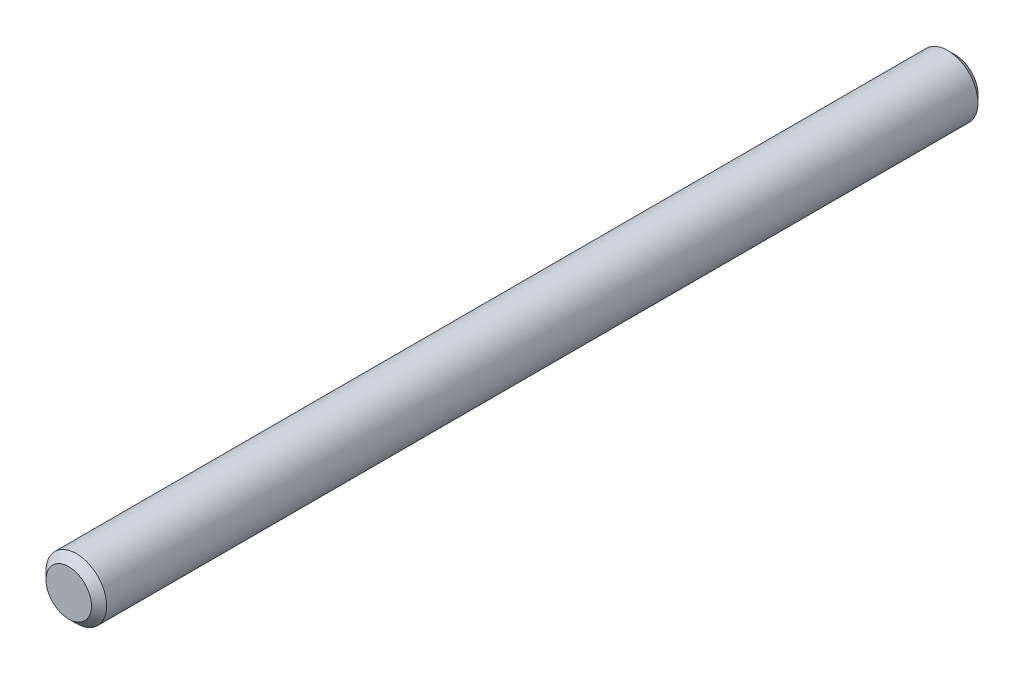
ISO-10303-21;
HEADER;
FILE_DESCRIPTION(('STEP AP214'),'2;1');
FILE_NAME('part.step','',(''),(''),'','','');
FILE_SCHEMA(('AUTOMOTIVE_DESIGN { 1 0 10303 214 1 1 1 1 }'));
ENDSEC;
DATA;
#1=APPLICATION_CONTEXT('core data for automotive mechanical design processes');
#2=APPLICATION_PROTOCOL_DEFINITION('international standard','automotive_design',2000,#1);
#3=PRODUCT_CONTEXT('',#1,'mechanical');
#4=PRODUCT('Part','Part','',(#3));
#5=PRODUCT_RELATED_PRODUCT_CATEGORY('part','',(#4));
#6=PRODUCT_DEFINITION_FORMATION('','',#4);
#7=PRODUCT_DEFINITION_CONTEXT('part definition',#1,'design');
#8=PRODUCT_DEFINITION('design','',#6,#7);
#9=PRODUCT_DEFINITION_SHAPE('','',#8);
#10=(LENGTH_UNIT() NAMED_UNIT(*) SI_UNIT(.MILLI.,.METRE.));
#11=(NAMED_UNIT(*) PLANE_ANGLE_UNIT() SI_UNIT($,.RADIAN.));
#12=(NAMED_UNIT(*) SI_UNIT($,.STERADIAN.) SOLID_ANGLE_UNIT());
#13=UNCERTAINTY_MEASURE_WITH_UNIT(LENGTH_MEASURE(1.E-05),#10,'distance_accuracy_value','');
#14=(GEOMETRIC_REPRESENTATION_CONTEXT(3) GLOBAL_UNCERTAINTY_ASSIGNED_CONTEXT((#13)) GLOBAL_UNIT_ASSIGNED_CONTEXT((#10,
#11,#12)) REPRESENTATION_CONTEXT('',''));
#15=CARTESIAN_POINT('',(0.,0.,0.));
#16=DIRECTION('',(0.,0.,1.));
#17=DIRECTION('',(1.,0.,0.));
#18=AXIS2_PLACEMENT_3D('',#15,#16,#17);
#19=CARTESIAN_POINT('',(0.,0.,11.7));
#20=DIRECTION('',(0.,0.,-1.));
#21=DIRECTION('',(-1.,0.,0.));
#22=AXIS2_PLACEMENT_3D('',#19,#20,#21);
#23=CYLINDRICAL_SURFACE('',#22,0.4);
#24=CARTESIAN_POINT('',(0.,0.,0.100000000000003));
#25=DIRECTION('',(0.,0.,1.));
#26=DIRECTION('',(1.,0.,0.));
#27=AXIS2_PLACEMENT_3D('',#24,#25,#26);
#28=CIRCLE('',#27,0.4);
#29=CARTESIAN_POINT('',(0.4,0.,0.100000000000003));
#30=VERTEX_POINT('',#29);
#31=EDGE_CURVE('E42',#30,#30,#28,.T.);
#32=ORIENTED_EDGE('',*,*,#31,.T.);
#33=EDGE_LOOP('',(#32));
#34=FACE_BOUND('',#33,.T.);
#35=CARTESIAN_POINT('',(0.,0.,11.6));
#36=DIRECTION('',(0.,0.,1.));
#37=DIRECTION('',(1.,0.,0.));
#38=AXIS2_PLACEMENT_3D('',#35,#36,#37);
#39=CIRCLE('',#38,0.4);
#40=CARTESIAN_POINT('',(0.4,0.,11.6));
#41=VERTEX_POINT('',#40);
#42=EDGE_CURVE('E46',#41,#41,#39,.F.);
#43=ORIENTED_EDGE('',*,*,#42,.T.);
#44=EDGE_LOOP('',(#43));
#45=FACE_BOUND('',#44,.T.);
#46=ADVANCED_FACE('F31',(#34,#45),#23,.T.);
#47=CARTESIAN_POINT('',(0.,0.,11.7));
#48=DIRECTION('',(0.,0.,1.));
#49=DIRECTION('',(1.,0.,0.));
#50=AXIS2_PLACEMENT_3D('',#47,#48,#49);
#51=PLANE('',#50);
#52=CARTESIAN_POINT('',(0.,0.,11.7));
#53=DIRECTION('',(0.,0.,1.));
#54=DIRECTION('',(1.,0.,0.));
#55=AXIS2_PLACEMENT_3D('',#52,#53,#54);
#56=CIRCLE('',#55,0.3);
#57=CARTESIAN_POINT('',(0.3,0.,11.7));
#58=VERTEX_POINT('',#57);
#59=EDGE_CURVE('E10',#58,#58,#56,.T.);
#60=ORIENTED_EDGE('',*,*,#59,.T.);
#61=EDGE_LOOP('',(#60));
#62=FACE_BOUND('',#61,.T.);
#63=ADVANCED_FACE('F62',(#62),#51,.T.);
#64=CARTESIAN_POINT('',(0.,0.,0.));
#65=DIRECTION('',(0.,0.,1.));
#66=DIRECTION('',(1.,0.,0.));
#67=AXIS2_PLACEMENT_3D('',#64,#65,#66);
#68=PLANE('',#67);
#69=CARTESIAN_POINT('',(0.,0.,0.));
#70=DIRECTION('',(0.,0.,1.));
#71=DIRECTION('',(1.,0.,0.));
#72=AXIS2_PLACEMENT_3D('',#69,#70,#71);
#73=CIRCLE('',#72,0.3);
#74=CARTESIAN_POINT('',(0.3,0.,0.));
#75=VERTEX_POINT('',#74);
#76=EDGE_CURVE('E38',#75,#75,#73,.F.);
#77=ORIENTED_EDGE('',*,*,#76,.T.);
#78=EDGE_LOOP('',(#77));
#79=FACE_BOUND('',#78,.T.);
#80=ADVANCED_FACE('F59',(#79),#68,.F.);
#81=CARTESIAN_POINT('',(0.,0.,0.100000000000003));
#82=DIRECTION('',(0.,0.,1.));
#83=DIRECTION('',(1.,0.,0.));
#84=AXIS2_PLACEMENT_3D('',#81,#82,#83);
#85=CONICAL_SURFACE('',#84,0.4,0.785398163397435);
#86=ORIENTED_EDGE('',*,*,#76,.F.);
#87=EDGE_LOOP('',(#86));
#88=FACE_BOUND('',#87,.T.);
#89=ORIENTED_EDGE('',*,*,#31,.F.);
#90=EDGE_LOOP('',(#89));
#91=FACE_BOUND('',#90,.T.);
#92=ADVANCED_FACE('F55',(#88,#91),#85,.T.);
#93=CARTESIAN_POINT('',(0.,0.,11.7));
#94=DIRECTION('',(0.,0.,-1.));
#95=DIRECTION('',(-1.,0.,0.));
#96=AXIS2_PLACEMENT_3D('',#93,#94,#95);
#97=CONICAL_SURFACE('',#96,0.3,0.785398163397443);
#98=ORIENTED_EDGE('',*,*,#42,.F.);
#99=EDGE_LOOP('',(#98));
#100=FACE_BOUND('',#99,.T.);
#101=ORIENTED_EDGE('',*,*,#59,.F.);
#102=EDGE_LOOP('',(#101));
#103=FACE_BOUND('',#102,.T.);
#104=ADVANCED_FACE('F33',(#100,#103),#97,.T.);
#105=CLOSED_SHELL('',(#46,#63,#80,#92,#104));
#106=MANIFOLD_SOLID_BREP('B2',#105);
#107=ADVANCED_BREP_SHAPE_REPRESENTATION('',(#18,#106),#14);
#108=SHAPE_DEFINITION_REPRESENTATION(#9,#107);
ENDSEC;
END-ISO-10303-21;
